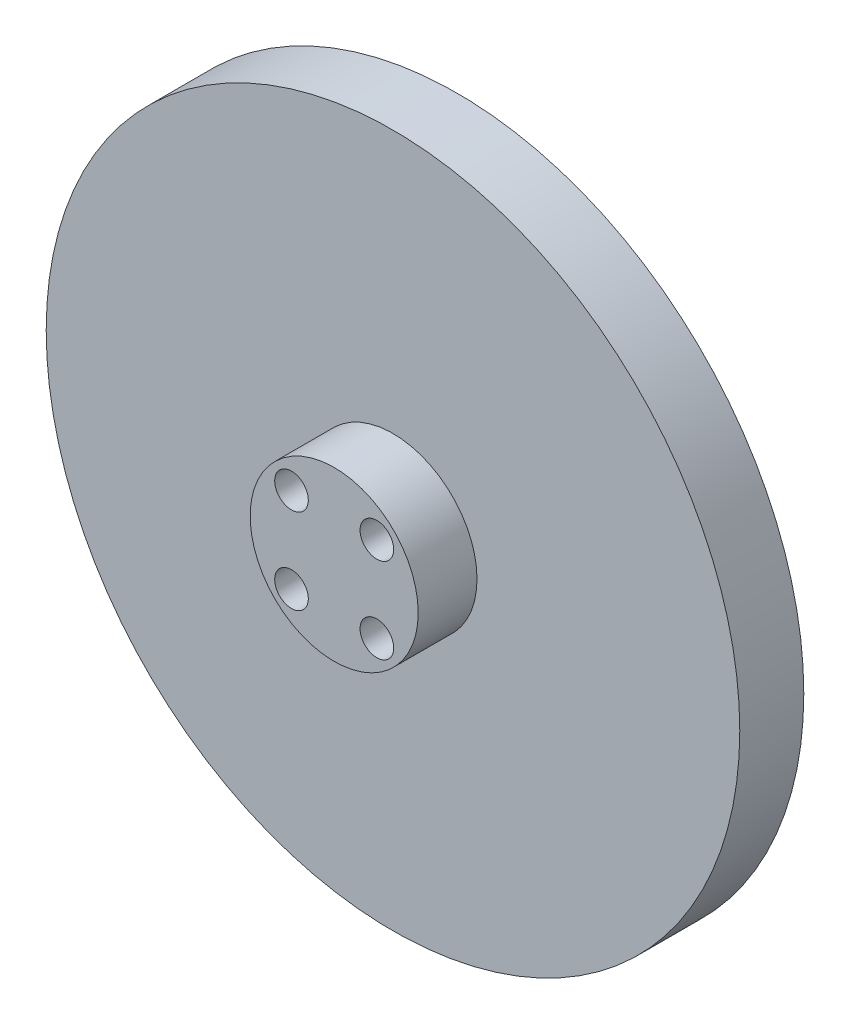
ISO-10303-21;
HEADER;
FILE_DESCRIPTION(('STEP AP214'),'2;1');
FILE_NAME('part.step','',(''),(''),'','','');
FILE_SCHEMA(('AUTOMOTIVE_DESIGN { 1 0 10303 214 1 1 1 1 }'));
ENDSEC;
DATA;
#1=APPLICATION_CONTEXT('core data for automotive mechanical design processes');
#2=APPLICATION_PROTOCOL_DEFINITION('international standard','automotive_design',2000,#1);
#3=PRODUCT_CONTEXT('',#1,'mechanical');
#4=PRODUCT('Part','Part','',(#3));
#5=PRODUCT_RELATED_PRODUCT_CATEGORY('part','',(#4));
#6=PRODUCT_DEFINITION_FORMATION('','',#4);
#7=PRODUCT_DEFINITION_CONTEXT('part definition',#1,'design');
#8=PRODUCT_DEFINITION('design','',#6,#7);
#9=PRODUCT_DEFINITION_SHAPE('','',#8);
#10=(LENGTH_UNIT() NAMED_UNIT(*) SI_UNIT(.MILLI.,.METRE.));
#11=(NAMED_UNIT(*) PLANE_ANGLE_UNIT() SI_UNIT($,.RADIAN.));
#12=(NAMED_UNIT(*) SI_UNIT($,.STERADIAN.) SOLID_ANGLE_UNIT());
#13=UNCERTAINTY_MEASURE_WITH_UNIT(LENGTH_MEASURE(1.E-05),#10,'distance_accuracy_value','');
#14=(GEOMETRIC_REPRESENTATION_CONTEXT(3) GLOBAL_UNCERTAINTY_ASSIGNED_CONTEXT((#13)) GLOBAL_UNIT_ASSIGNED_CONTEXT((#10,
#11,#12)) REPRESENTATION_CONTEXT('',''));
#15=CARTESIAN_POINT('',(0.,0.,0.));
#16=DIRECTION('',(0.,0.,1.));
#17=DIRECTION('',(1.,0.,0.));
#18=AXIS2_PLACEMENT_3D('',#15,#16,#17);
#19=CARTESIAN_POINT('',(0.,0.,3.81));
#20=DIRECTION('',(0.,0.,-1.));
#21=DIRECTION('',(-1.,0.,0.));
#22=AXIS2_PLACEMENT_3D('',#19,#20,#21);
#23=CYLINDRICAL_SURFACE('',#22,41.275);
#24=CARTESIAN_POINT('',(0.,0.,3.81));
#25=DIRECTION('',(0.,0.,1.));
#26=DIRECTION('',(1.,0.,0.));
#27=AXIS2_PLACEMENT_3D('',#24,#25,#26);
#28=CIRCLE('',#27,41.275);
#29=CARTESIAN_POINT('',(-41.275,0.,3.81));
#30=VERTEX_POINT('',#29);
#31=EDGE_CURVE('E42',#30,#30,#28,.T.);
#32=CARTESIAN_POINT('',(0.,0.,-3.81));
#33=DIRECTION('',(0.,0.,1.));
#34=DIRECTION('',(1.,0.,0.));
#35=AXIS2_PLACEMENT_3D('',#32,#33,#34);
#36=CIRCLE('',#35,41.275);
#37=CARTESIAN_POINT('',(-41.275,0.,-3.81));
#38=VERTEX_POINT('',#37);
#39=EDGE_CURVE('E38',#38,#38,#36,.T.);
#40=CARTESIAN_POINT('',(-41.275,0.,3.81));
#41=CARTESIAN_POINT('',(-41.275,0.,3.730625));
#42=CARTESIAN_POINT('',(-41.275,0.,3.65125));
#43=CARTESIAN_POINT('',(-41.275,0.,3.4925));
#44=CARTESIAN_POINT('',(-41.275,0.,3.413125));
#45=CARTESIAN_POINT('',(-41.275,0.,3.254375));
#46=CARTESIAN_POINT('',(-41.275,0.,3.175));
#47=CARTESIAN_POINT('',(-41.275,0.,3.01625));
#48=CARTESIAN_POINT('',(-41.275,0.,2.936875));
#49=CARTESIAN_POINT('',(-41.275,0.,2.778125));
#50=CARTESIAN_POINT('',(-41.275,0.,2.69875));
#51=CARTESIAN_POINT('',(-41.275,0.,2.54));
#52=CARTESIAN_POINT('',(-41.275,0.,2.460625));
#53=CARTESIAN_POINT('',(-41.275,0.,2.301875));
#54=CARTESIAN_POINT('',(-41.275,0.,2.2225));
#55=CARTESIAN_POINT('',(-41.275,0.,2.06375));
#56=CARTESIAN_POINT('',(-41.275,0.,1.984375));
#57=CARTESIAN_POINT('',(-41.275,0.,1.825625));
#58=CARTESIAN_POINT('',(-41.275,0.,1.74625));
#59=CARTESIAN_POINT('',(-41.275,0.,1.5875));
#60=CARTESIAN_POINT('',(-41.275,0.,1.508125));
#61=CARTESIAN_POINT('',(-41.275,0.,1.349375));
#62=CARTESIAN_POINT('',(-41.275,0.,1.27));
#63=CARTESIAN_POINT('',(-41.275,0.,1.11125));
#64=CARTESIAN_POINT('',(-41.275,0.,1.031875));
#65=CARTESIAN_POINT('',(-41.275,0.,0.873125));
#66=CARTESIAN_POINT('',(-41.275,0.,0.79375));
#67=CARTESIAN_POINT('',(-41.275,0.,0.635));
#68=CARTESIAN_POINT('',(-41.275,0.,0.555625));
#69=CARTESIAN_POINT('',(-41.275,0.,0.396875));
#70=CARTESIAN_POINT('',(-41.275,0.,0.3175));
#71=CARTESIAN_POINT('',(-41.275,0.,0.15875));
#72=CARTESIAN_POINT('',(-41.275,0.,0.0793749999999996));
#73=CARTESIAN_POINT('',(-41.275,0.,-0.079375));
#74=CARTESIAN_POINT('',(-41.275,0.,-0.15875));
#75=CARTESIAN_POINT('',(-41.275,0.,-0.317499999999999));
#76=CARTESIAN_POINT('',(-41.275,0.,-0.396874999999999));
#77=CARTESIAN_POINT('',(-41.275,0.,-0.555625));
#78=CARTESIAN_POINT('',(-41.275,0.,-0.634999999999999));
#79=CARTESIAN_POINT('',(-41.275,0.,-0.79375));
#80=CARTESIAN_POINT('',(-41.275,0.,-0.873125));
#81=CARTESIAN_POINT('',(-41.275,0.,-1.031875));
#82=CARTESIAN_POINT('',(-41.275,0.,-1.11125));
#83=CARTESIAN_POINT('',(-41.275,0.,-1.27));
#84=CARTESIAN_POINT('',(-41.275,0.,-1.349375));
#85=CARTESIAN_POINT('',(-41.275,0.,-1.508125));
#86=CARTESIAN_POINT('',(-41.275,0.,-1.5875));
#87=CARTESIAN_POINT('',(-41.275,0.,-1.74625));
#88=CARTESIAN_POINT('',(-41.275,0.,-1.825625));
#89=CARTESIAN_POINT('',(-41.275,0.,-1.984375));
#90=CARTESIAN_POINT('',(-41.275,0.,-2.06375));
#91=CARTESIAN_POINT('',(-41.275,0.,-2.2225));
#92=CARTESIAN_POINT('',(-41.275,0.,-2.301875));
#93=CARTESIAN_POINT('',(-41.275,0.,-2.460625));
#94=CARTESIAN_POINT('',(-41.275,0.,-2.54));
#95=CARTESIAN_POINT('',(-41.275,0.,-2.69875));
#96=CARTESIAN_POINT('',(-41.275,0.,-2.778125));
#97=CARTESIAN_POINT('',(-41.275,0.,-2.936875));
#98=CARTESIAN_POINT('',(-41.275,0.,-3.01625));
#99=CARTESIAN_POINT('',(-41.275,0.,-3.175));
#100=CARTESIAN_POINT('',(-41.275,0.,-3.254375));
#101=CARTESIAN_POINT('',(-41.275,0.,-3.413125));
#102=CARTESIAN_POINT('',(-41.275,0.,-3.4925));
#103=CARTESIAN_POINT('',(-41.275,0.,-3.65125));
#104=CARTESIAN_POINT('',(-41.275,0.,-3.730625));
#105=CARTESIAN_POINT('',(-41.275,0.,-3.81));
#106=B_SPLINE_CURVE_WITH_KNOTS('',3,(#40,#41,#42,#43,#44,#45,#46,#47,#48,#49,#50,#51,#52,#53,
#54,#55,#56,#57,#58,#59,#60,#61,#62,#63,#64,#65,#66,#67,#68,#69,#70,#71,#72,#73,#74,#75,#76,#77,
#78,#79,#80,#81,#82,#83,#84,#85,#86,#87,#88,#89,#90,#91,#92,#93,#94,#95,#96,#97,#98,#99,#100,
#101,#102,#103,#104,#105),.UNSPECIFIED.,.F.,.F.,(4,2,2,2,2,2,2,2,2,2,2,2,2,2,2,2,2,2,2,2,2,2,2,
2,2,2,2,2,2,2,2,2,4),(0.,0.238125,0.47625,0.714375,0.9525,1.190625,1.42875,1.666875,1.905,
2.143125,2.38125,2.619375,2.8575,3.095625,3.33375,3.571875,3.81,4.048125,4.28625,4.524375,
4.7625,5.000625,5.23875,5.476875,5.715,5.953125,6.19125,6.429375,6.6675,6.905625,7.14375,
7.381875,7.62),.UNSPECIFIED.);
#107=EDGE_CURVE('BSEAM35',#30,#38,#106,.T.);
#108=ORIENTED_EDGE('',*,*,#31,.F.);
#109=ORIENTED_EDGE('',*,*,#39,.T.);
#110=ORIENTED_EDGE('',*,*,#107,.T.);
#111=ORIENTED_EDGE('',*,*,#107,.F.);
#112=EDGE_LOOP('',(#108,#110,#109,#111));
#113=FACE_BOUND('',#112,.T.);
#114=ADVANCED_FACE('F35',(#113),#23,.T.);
#115=CARTESIAN_POINT('',(0.,0.,3.81));
#116=DIRECTION('',(0.,0.,1.));
#117=DIRECTION('',(1.,0.,0.));
#118=AXIS2_PLACEMENT_3D('',#115,#116,#117);
#119=PLANE('',#118);
#120=CARTESIAN_POINT('',(0.,0.,3.81));
#121=DIRECTION('',(0.,0.,1.));
#122=DIRECTION('',(1.,0.,0.));
#123=AXIS2_PLACEMENT_3D('',#120,#121,#122);
#124=CIRCLE('',#123,9.999849952);
#125=CARTESIAN_POINT('',(9.999849952,0.,3.81));
#126=VERTEX_POINT('',#125);
#127=EDGE_CURVE('E10',#126,#126,#124,.T.);
#128=ORIENTED_EDGE('',*,*,#127,.F.);
#129=EDGE_LOOP('',(#128));
#130=FACE_BOUND('',#129,.T.);
#131=ORIENTED_EDGE('',*,*,#31,.T.);
#132=EDGE_LOOP('',(#131));
#133=FACE_BOUND('',#132,.T.);
#134=ADVANCED_FACE('F105',(#130,#133),#119,.T.);
#135=CARTESIAN_POINT('',(0.,0.,-3.81));
#136=DIRECTION('',(0.,0.,1.));
#137=DIRECTION('',(1.,0.,0.));
#138=AXIS2_PLACEMENT_3D('',#135,#136,#137);
#139=PLANE('',#138);
#140=CARTESIAN_POINT('',(-5.08000000000002,5.07999999999998,-3.81));
#141=DIRECTION('',(0.,0.,1.));
#142=DIRECTION('',(0.,1.,0.));
#143=AXIS2_PLACEMENT_3D('',#140,#141,#142);
#144=CIRCLE('',#143,2.);
#145=CARTESIAN_POINT('',(-5.08000000000002,7.07999999999999,-3.81));
#146=VERTEX_POINT('',#145);
#147=EDGE_CURVE('E55',#146,#146,#144,.T.);
#148=ORIENTED_EDGE('',*,*,#147,.T.);
#149=EDGE_LOOP('',(#148));
#150=FACE_BOUND('',#149,.T.);
#151=CARTESIAN_POINT('',(-5.08,-5.08,-3.81));
#152=DIRECTION('',(0.,0.,1.));
#153=DIRECTION('',(-1.,0.,0.));
#154=AXIS2_PLACEMENT_3D('',#151,#152,#153);
#155=CIRCLE('',#154,2.);
#156=CARTESIAN_POINT('',(-7.08,-5.08,-3.81));
#157=VERTEX_POINT('',#156);
#158=EDGE_CURVE('E67',#157,#157,#155,.T.);
#159=ORIENTED_EDGE('',*,*,#158,.T.);
#160=EDGE_LOOP('',(#159));
#161=FACE_BOUND('',#160,.T.);
#162=CARTESIAN_POINT('',(5.08000000000005,-5.07999999999995,-3.81));
#163=DIRECTION('',(0.,0.,1.));
#164=DIRECTION('',(0.,-1.,0.));
#165=AXIS2_PLACEMENT_3D('',#162,#163,#164);
#166=CIRCLE('',#165,2.);
#167=CARTESIAN_POINT('',(5.08000000000007,-7.07999999999995,-3.81));
#168=VERTEX_POINT('',#167);
#169=EDGE_CURVE('E61',#168,#168,#166,.T.);
#170=ORIENTED_EDGE('',*,*,#169,.T.);
#171=EDGE_LOOP('',(#170));
#172=FACE_BOUND('',#171,.T.);
#173=CARTESIAN_POINT('',(5.08,5.08,-3.81));
#174=DIRECTION('',(0.,0.,1.));
#175=DIRECTION('',(1.,0.,0.));
#176=AXIS2_PLACEMENT_3D('',#173,#174,#175);
#177=CIRCLE('',#176,2.);
#178=CARTESIAN_POINT('',(7.08,5.08,-3.81));
#179=VERTEX_POINT('',#178);
#180=EDGE_CURVE('E51',#179,#179,#177,.T.);
#181=ORIENTED_EDGE('',*,*,#180,.T.);
#182=EDGE_LOOP('',(#181));
#183=FACE_BOUND('',#182,.T.);
#184=ORIENTED_EDGE('',*,*,#39,.F.);
#185=EDGE_LOOP('',(#184));
#186=FACE_BOUND('',#185,.T.);
#187=ADVANCED_FACE('F76',(#150,#161,#172,#183,#186),#139,.F.);
#188=CARTESIAN_POINT('',(0.,0.,10.81));
#189=DIRECTION('',(0.,0.,-1.));
#190=DIRECTION('',(-1.,0.,0.));
#191=AXIS2_PLACEMENT_3D('',#188,#189,#190);
#192=CYLINDRICAL_SURFACE('',#191,9.999849952);
#193=CARTESIAN_POINT('',(0.,0.,10.81));
#194=DIRECTION('',(0.,0.,1.));
#195=DIRECTION('',(1.,0.,0.));
#196=AXIS2_PLACEMENT_3D('',#193,#194,#195);
#197=CIRCLE('',#196,9.999849952);
#198=CARTESIAN_POINT('',(9.999849952,0.,10.81));
#199=VERTEX_POINT('',#198);
#200=EDGE_CURVE('E48',#199,#199,#197,.T.);
#201=ORIENTED_EDGE('',*,*,#200,.F.);
#202=EDGE_LOOP('',(#201));
#203=FACE_BOUND('',#202,.T.);
#204=ORIENTED_EDGE('',*,*,#127,.T.);
#205=EDGE_LOOP('',(#204));
#206=FACE_BOUND('',#205,.T.);
#207=ADVANCED_FACE('F90',(#203,#206),#192,.T.);
#208=CARTESIAN_POINT('',(0.,0.,10.81));
#209=DIRECTION('',(0.,0.,1.));
#210=DIRECTION('',(1.,0.,0.));
#211=AXIS2_PLACEMENT_3D('',#208,#209,#210);
#212=PLANE('',#211);
#213=CARTESIAN_POINT('',(-5.08000000000002,5.07999999999998,10.81));
#214=DIRECTION('',(0.,0.,1.));
#215=DIRECTION('',(0.,1.,0.));
#216=AXIS2_PLACEMENT_3D('',#213,#214,#215);
#217=CIRCLE('',#216,2.);
#218=CARTESIAN_POINT('',(-5.08000000000002,7.07999999999999,10.81));
#219=VERTEX_POINT('',#218);
#220=EDGE_CURVE('E70',#219,#219,#217,.T.);
#221=ORIENTED_EDGE('',*,*,#220,.F.);
#222=EDGE_LOOP('',(#221));
#223=FACE_BOUND('',#222,.T.);
#224=CARTESIAN_POINT('',(-5.08,-5.08,10.81));
#225=DIRECTION('',(0.,0.,1.));
#226=DIRECTION('',(-1.,0.,0.));
#227=AXIS2_PLACEMENT_3D('',#224,#225,#226);
#228=CIRCLE('',#227,2.);
#229=CARTESIAN_POINT('',(-7.08,-5.08,10.81));
#230=VERTEX_POINT('',#229);
#231=EDGE_CURVE('E64',#230,#230,#228,.T.);
#232=ORIENTED_EDGE('',*,*,#231,.F.);
#233=EDGE_LOOP('',(#232));
#234=FACE_BOUND('',#233,.T.);
#235=CARTESIAN_POINT('',(5.08000000000005,-5.07999999999995,10.81));
#236=DIRECTION('',(0.,0.,1.));
#237=DIRECTION('',(0.,-1.,0.));
#238=AXIS2_PLACEMENT_3D('',#235,#236,#237);
#239=CIRCLE('',#238,2.);
#240=CARTESIAN_POINT('',(5.08000000000007,-7.07999999999995,10.81));
#241=VERTEX_POINT('',#240);
#242=EDGE_CURVE('E58',#241,#241,#239,.T.);
#243=ORIENTED_EDGE('',*,*,#242,.F.);
#244=EDGE_LOOP('',(#243));
#245=FACE_BOUND('',#244,.T.);
#246=CARTESIAN_POINT('',(5.08,5.08,10.81));
#247=DIRECTION('',(0.,0.,1.));
#248=DIRECTION('',(1.,0.,0.));
#249=AXIS2_PLACEMENT_3D('',#246,#247,#248);
#250=CIRCLE('',#249,2.);
#251=CARTESIAN_POINT('',(7.08,5.08,10.81));
#252=VERTEX_POINT('',#251);
#253=EDGE_CURVE('E52',#252,#252,#250,.T.);
#254=ORIENTED_EDGE('',*,*,#253,.F.);
#255=EDGE_LOOP('',(#254));
#256=FACE_BOUND('',#255,.T.);
#257=ORIENTED_EDGE('',*,*,#200,.T.);
#258=EDGE_LOOP('',(#257));
#259=FACE_BOUND('',#258,.T.);
#260=ADVANCED_FACE('F86',(#223,#234,#245,#256,#259),#212,.T.);
#261=CARTESIAN_POINT('',(5.08,5.08,-3.81));
#262=DIRECTION('',(0.,0.,1.));
#263=DIRECTION('',(1.,0.,0.));
#264=AXIS2_PLACEMENT_3D('',#261,#262,#263);
#265=CYLINDRICAL_SURFACE('',#264,2.);
#266=ORIENTED_EDGE('',*,*,#180,.F.);
#267=EDGE_LOOP('',(#266));
#268=FACE_BOUND('',#267,.T.);
#269=ORIENTED_EDGE('',*,*,#253,.T.);
#270=EDGE_LOOP('',(#269));
#271=FACE_BOUND('',#270,.T.);
#272=ADVANCED_FACE('F89',(#268,#271),#265,.F.);
#273=CARTESIAN_POINT('',(5.08000000000005,-5.07999999999995,-3.81));
#274=DIRECTION('',(0.,0.,1.));
#275=DIRECTION('',(1.,0.,0.));
#276=AXIS2_PLACEMENT_3D('',#273,#274,#275);
#277=CYLINDRICAL_SURFACE('',#276,2.);
#278=ORIENTED_EDGE('',*,*,#169,.F.);
#279=EDGE_LOOP('',(#278));
#280=FACE_BOUND('',#279,.T.);
#281=ORIENTED_EDGE('',*,*,#242,.T.);
#282=EDGE_LOOP('',(#281));
#283=FACE_BOUND('',#282,.T.);
#284=ADVANCED_FACE('F141',(#280,#283),#277,.F.);
#285=CARTESIAN_POINT('',(-5.08,-5.08,-3.81));
#286=DIRECTION('',(0.,0.,1.));
#287=DIRECTION('',(1.,0.,0.));
#288=AXIS2_PLACEMENT_3D('',#285,#286,#287);
#289=CYLINDRICAL_SURFACE('',#288,2.);
#290=ORIENTED_EDGE('',*,*,#158,.F.);
#291=EDGE_LOOP('',(#290));
#292=FACE_BOUND('',#291,.T.);
#293=ORIENTED_EDGE('',*,*,#231,.T.);
#294=EDGE_LOOP('',(#293));
#295=FACE_BOUND('',#294,.T.);
#296=ADVANCED_FACE('F82',(#292,#295),#289,.F.);
#297=CARTESIAN_POINT('',(-5.08000000000002,5.07999999999998,-3.81));
#298=DIRECTION('',(0.,0.,1.));
#299=DIRECTION('',(1.,0.,0.));
#300=AXIS2_PLACEMENT_3D('',#297,#298,#299);
#301=CYLINDRICAL_SURFACE('',#300,2.);
#302=ORIENTED_EDGE('',*,*,#147,.F.);
#303=EDGE_LOOP('',(#302));
#304=FACE_BOUND('',#303,.T.);
#305=ORIENTED_EDGE('',*,*,#220,.T.);
#306=EDGE_LOOP('',(#305));
#307=FACE_BOUND('',#306,.T.);
#308=ADVANCED_FACE('F79',(#304,#307),#301,.F.);
#309=CLOSED_SHELL('',(#114,#134,#187,#207,#260,#272,#284,#296,#308));
#310=MANIFOLD_SOLID_BREP('B2',#309);
#311=ADVANCED_BREP_SHAPE_REPRESENTATION('',(#18,#310),#14);
#312=SHAPE_DEFINITION_REPRESENTATION(#9,#311);
ENDSEC;
END-ISO-10303-21;
